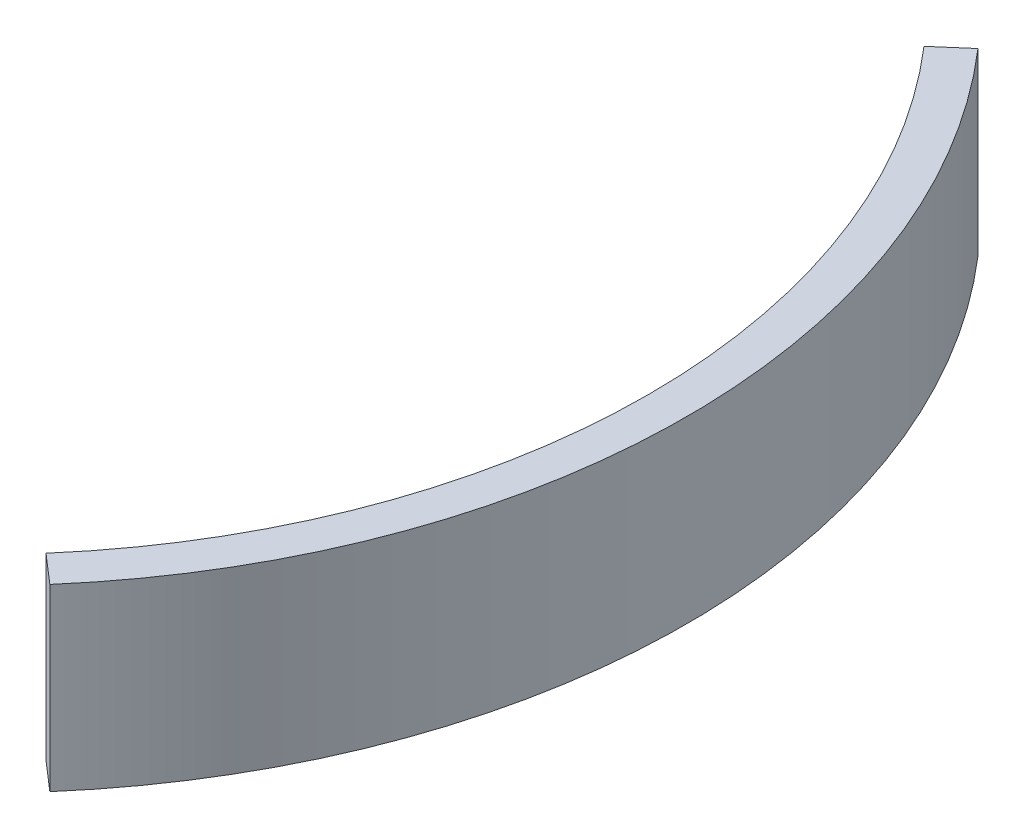
ISO-10303-21;
HEADER;
FILE_DESCRIPTION(('STEP AP214'),'2;1');
FILE_NAME('part.step','',(''),(''),'','','');
FILE_SCHEMA(('AUTOMOTIVE_DESIGN { 1 0 10303 214 1 1 1 1 }'));
ENDSEC;
DATA;
#1=APPLICATION_CONTEXT('core data for automotive mechanical design processes');
#2=APPLICATION_PROTOCOL_DEFINITION('international standard','automotive_design',2000,#1);
#3=PRODUCT_CONTEXT('',#1,'mechanical');
#4=PRODUCT('Part','Part','',(#3));
#5=PRODUCT_RELATED_PRODUCT_CATEGORY('part','',(#4));
#6=PRODUCT_DEFINITION_FORMATION('','',#4);
#7=PRODUCT_DEFINITION_CONTEXT('part definition',#1,'design');
#8=PRODUCT_DEFINITION('design','',#6,#7);
#9=PRODUCT_DEFINITION_SHAPE('','',#8);
#10=(LENGTH_UNIT() NAMED_UNIT(*) SI_UNIT(.MILLI.,.METRE.));
#11=(NAMED_UNIT(*) PLANE_ANGLE_UNIT() SI_UNIT($,.RADIAN.));
#12=(NAMED_UNIT(*) SI_UNIT($,.STERADIAN.) SOLID_ANGLE_UNIT());
#13=UNCERTAINTY_MEASURE_WITH_UNIT(LENGTH_MEASURE(1.E-05),#10,'distance_accuracy_value','');
#14=(GEOMETRIC_REPRESENTATION_CONTEXT(3) GLOBAL_UNCERTAINTY_ASSIGNED_CONTEXT((#13)) GLOBAL_UNIT_ASSIGNED_CONTEXT((#10,
#11,#12)) REPRESENTATION_CONTEXT('',''));
#15=CARTESIAN_POINT('',(0.,0.,0.));
#16=DIRECTION('',(0.,0.,1.));
#17=DIRECTION('',(1.,0.,0.));
#18=AXIS2_PLACEMENT_3D('',#15,#16,#17);
#19=CARTESIAN_POINT('',(0.,15.,0.));
#20=DIRECTION('',(0.,-1.,0.));
#21=DIRECTION('',(0.,0.,-1.));
#22=AXIS2_PLACEMENT_3D('',#19,#20,#21);
#23=CYLINDRICAL_SURFACE('',#22,56.);
#24=CARTESIAN_POINT('',(0.,0.,0.));
#25=DIRECTION('',(0.,-1.,0.));
#26=DIRECTION('',(0.,0.,-1.));
#27=AXIS2_PLACEMENT_3D('',#24,#25,#26);
#28=CIRCLE('',#27,56.);
#29=CARTESIAN_POINT('',(42.311435415239,0.,-36.6843622419971));
#30=VERTEX_POINT('',#29);
#31=CARTESIAN_POINT('',(42.311435415239,0.,36.6843622419971));
#32=VERTEX_POINT('',#31);
#33=EDGE_CURVE('E107',#30,#32,#28,.T.);
#34=ORIENTED_EDGE('',*,*,#33,.T.);
#35=DIRECTION('',(0.,-1.,0.));
#36=VECTOR('',#35,1.);
#37=CARTESIAN_POINT('',(42.311435415239,15.,36.6843622419971));
#38=LINE('',#37,#36);
#39=CARTESIAN_POINT('',(42.311435415239,15.,36.6843622419971));
#40=VERTEX_POINT('',#39);
#41=EDGE_CURVE('E11',#40,#32,#38,.T.);
#42=ORIENTED_EDGE('',*,*,#41,.F.);
#43=CARTESIAN_POINT('',(0.,15.,0.));
#44=DIRECTION('',(0.,-1.,0.));
#45=DIRECTION('',(0.,0.,-1.));
#46=AXIS2_PLACEMENT_3D('',#43,#44,#45);
#47=CIRCLE('',#46,56.);
#48=CARTESIAN_POINT('',(42.311435415239,15.,-36.6843622419971));
#49=VERTEX_POINT('',#48);
#50=EDGE_CURVE('E91',#49,#40,#47,.T.);
#51=ORIENTED_EDGE('',*,*,#50,.F.);
#52=DIRECTION('',(0.,-1.,0.));
#53=VECTOR('',#52,1.);
#54=CARTESIAN_POINT('',(42.311435415239,15.,-36.6843622419971));
#55=LINE('',#54,#53);
#56=EDGE_CURVE('E103',#49,#30,#55,.T.);
#57=ORIENTED_EDGE('',*,*,#56,.T.);
#58=EDGE_LOOP('',(#34,#42,#51,#57));
#59=FACE_BOUND('',#58,.T.);
#60=ADVANCED_FACE('F39',(#59),#23,.F.);
#61=CARTESIAN_POINT('',(44.7292317246812,15.,38.7806115129684));
#62=DIRECTION('',(0.655077897178529,0.,-0.755561346700687));
#63=DIRECTION('',(-0.755561346700687,0.,-0.655077897178529));
#64=AXIS2_PLACEMENT_3D('',#61,#62,#63);
#65=PLANE('',#64);
#66=DIRECTION('',(0.755561346700687,0.,0.655077897178529));
#67=VECTOR('',#66,1.);
#68=CARTESIAN_POINT('',(44.7292317246812,0.,38.7806115129684));
#69=LINE('',#68,#67);
#70=CARTESIAN_POINT('',(44.7292317246812,0.,38.7806115129684));
#71=VERTEX_POINT('',#70);
#72=EDGE_CURVE('E96',#32,#71,#69,.T.);
#73=ORIENTED_EDGE('',*,*,#72,.T.);
#74=DIRECTION('',(0.,-1.,0.));
#75=VECTOR('',#74,1.);
#76=CARTESIAN_POINT('',(44.7292317246812,15.,38.7806115129684));
#77=LINE('',#76,#75);
#78=CARTESIAN_POINT('',(44.7292317246812,15.,38.7806115129684));
#79=VERTEX_POINT('',#78);
#80=EDGE_CURVE('E48',#79,#71,#77,.T.);
#81=ORIENTED_EDGE('',*,*,#80,.F.);
#82=DIRECTION('',(0.755561346700687,0.,0.655077897178529));
#83=VECTOR('',#82,1.);
#84=CARTESIAN_POINT('',(44.7292317246812,15.,38.7806115129684));
#85=LINE('',#84,#83);
#86=EDGE_CURVE('E86',#40,#79,#85,.T.);
#87=ORIENTED_EDGE('',*,*,#86,.F.);
#88=ORIENTED_EDGE('',*,*,#41,.T.);
#89=EDGE_LOOP('',(#73,#81,#87,#88));
#90=FACE_BOUND('',#89,.T.);
#91=ADVANCED_FACE('F95',(#90),#65,.F.);
#92=CARTESIAN_POINT('',(0.,15.,0.));
#93=DIRECTION('',(0.,-1.,0.));
#94=DIRECTION('',(0.,0.,-1.));
#95=AXIS2_PLACEMENT_3D('',#92,#93,#94);
#96=CYLINDRICAL_SURFACE('',#95,59.2);
#97=CARTESIAN_POINT('',(0.,0.,0.));
#98=DIRECTION('',(0.,1.,0.));
#99=DIRECTION('',(0.,0.,-1.));
#100=AXIS2_PLACEMENT_3D('',#97,#98,#99);
#101=CIRCLE('',#100,59.2);
#102=CARTESIAN_POINT('',(44.7292317246812,0.,-38.7806115129683));
#103=VERTEX_POINT('',#102);
#104=EDGE_CURVE('E73',#71,#103,#101,.T.);
#105=ORIENTED_EDGE('',*,*,#104,.T.);
#106=DIRECTION('',(0.,-1.,0.));
#107=VECTOR('',#106,1.);
#108=CARTESIAN_POINT('',(44.7292317246812,15.,-38.7806115129683));
#109=LINE('',#108,#107);
#110=CARTESIAN_POINT('',(44.7292317246812,15.,-38.7806115129683));
#111=VERTEX_POINT('',#110);
#112=EDGE_CURVE('E98',#111,#103,#109,.T.);
#113=ORIENTED_EDGE('',*,*,#112,.F.);
#114=CARTESIAN_POINT('',(0.,15.,0.));
#115=DIRECTION('',(0.,1.,0.));
#116=DIRECTION('',(0.,0.,-1.));
#117=AXIS2_PLACEMENT_3D('',#114,#115,#116);
#118=CIRCLE('',#117,59.2);
#119=EDGE_CURVE('E89',#79,#111,#118,.T.);
#120=ORIENTED_EDGE('',*,*,#119,.F.);
#121=ORIENTED_EDGE('',*,*,#80,.T.);
#122=EDGE_LOOP('',(#105,#113,#120,#121));
#123=FACE_BOUND('',#122,.T.);
#124=ADVANCED_FACE('F99',(#123),#96,.T.);
#125=CARTESIAN_POINT('',(42.311435415239,15.,-36.6843622419971));
#126=DIRECTION('',(0.655077897178525,0.,0.755561346700691));
#127=DIRECTION('',(0.755561346700691,0.,-0.655077897178525));
#128=AXIS2_PLACEMENT_3D('',#125,#126,#127);
#129=PLANE('',#128);
#130=DIRECTION('',(-0.755561346700691,0.,0.655077897178525));
#131=VECTOR('',#130,1.);
#132=CARTESIAN_POINT('',(42.311435415239,0.,-36.6843622419971));
#133=LINE('',#132,#131);
#134=EDGE_CURVE('E79',#103,#30,#133,.T.);
#135=ORIENTED_EDGE('',*,*,#134,.T.);
#136=ORIENTED_EDGE('',*,*,#56,.F.);
#137=DIRECTION('',(-0.755561346700691,0.,0.655077897178525));
#138=VECTOR('',#137,1.);
#139=CARTESIAN_POINT('',(42.311435415239,15.,-36.6843622419971));
#140=LINE('',#139,#138);
#141=EDGE_CURVE('E56',#111,#49,#140,.T.);
#142=ORIENTED_EDGE('',*,*,#141,.F.);
#143=ORIENTED_EDGE('',*,*,#112,.T.);
#144=EDGE_LOOP('',(#135,#136,#142,#143));
#145=FACE_BOUND('',#144,.T.);
#146=ADVANCED_FACE('F120',(#145),#129,.F.);
#147=CARTESIAN_POINT('',(0.,15.,0.));
#148=DIRECTION('',(0.,-1.,0.));
#149=DIRECTION('',(0.,0.,-1.));
#150=AXIS2_PLACEMENT_3D('',#147,#148,#149);
#151=PLANE('',#150);
#152=ORIENTED_EDGE('',*,*,#50,.T.);
#153=ORIENTED_EDGE('',*,*,#86,.T.);
#154=ORIENTED_EDGE('',*,*,#119,.T.);
#155=ORIENTED_EDGE('',*,*,#141,.T.);
#156=EDGE_LOOP('',(#152,#153,#154,#155));
#157=FACE_BOUND('',#156,.T.);
#158=ADVANCED_FACE('F87',(#157),#151,.F.);
#159=CARTESIAN_POINT('',(0.,0.,0.));
#160=DIRECTION('',(0.,-1.,0.));
#161=DIRECTION('',(0.,0.,-1.));
#162=AXIS2_PLACEMENT_3D('',#159,#160,#161);
#163=PLANE('',#162);
#164=ORIENTED_EDGE('',*,*,#33,.F.);
#165=ORIENTED_EDGE('',*,*,#134,.F.);
#166=ORIENTED_EDGE('',*,*,#104,.F.);
#167=ORIENTED_EDGE('',*,*,#72,.F.);
#168=EDGE_LOOP('',(#164,#165,#166,#167));
#169=FACE_BOUND('',#168,.T.);
#170=ADVANCED_FACE('F123',(#169),#163,.T.);
#171=CLOSED_SHELL('',(#60,#91,#124,#146,#158,#170));
#172=MANIFOLD_SOLID_BREP('B2',#171);
#173=ADVANCED_BREP_SHAPE_REPRESENTATION('',(#18,#172),#14);
#174=SHAPE_DEFINITION_REPRESENTATION(#9,#173);
ENDSEC;
END-ISO-10303-21;
